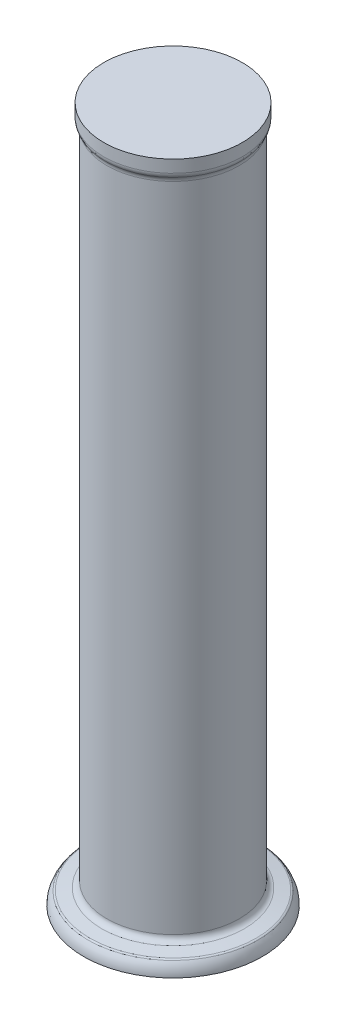
ISO-10303-21;
HEADER;
FILE_DESCRIPTION(('STEP AP214'),'2;1');
FILE_NAME('part.step','',(''),(''),'','','');
FILE_SCHEMA(('AUTOMOTIVE_DESIGN { 1 0 10303 214 1 1 1 1 }'));
ENDSEC;
DATA;
#1=APPLICATION_CONTEXT('core data for automotive mechanical design processes');
#2=APPLICATION_PROTOCOL_DEFINITION('international standard','automotive_design',2000,#1);
#3=PRODUCT_CONTEXT('',#1,'mechanical');
#4=PRODUCT('Part','Part','',(#3));
#5=PRODUCT_RELATED_PRODUCT_CATEGORY('part','',(#4));
#6=PRODUCT_DEFINITION_FORMATION('','',#4);
#7=PRODUCT_DEFINITION_CONTEXT('part definition',#1,'design');
#8=PRODUCT_DEFINITION('design','',#6,#7);
#9=PRODUCT_DEFINITION_SHAPE('','',#8);
#10=(LENGTH_UNIT() NAMED_UNIT(*) SI_UNIT(.MILLI.,.METRE.));
#11=(NAMED_UNIT(*) PLANE_ANGLE_UNIT() SI_UNIT($,.RADIAN.));
#12=(NAMED_UNIT(*) SI_UNIT($,.STERADIAN.) SOLID_ANGLE_UNIT());
#13=UNCERTAINTY_MEASURE_WITH_UNIT(LENGTH_MEASURE(1.E-05),#10,'distance_accuracy_value','');
#14=(GEOMETRIC_REPRESENTATION_CONTEXT(3) GLOBAL_UNCERTAINTY_ASSIGNED_CONTEXT((#13)) GLOBAL_UNIT_ASSIGNED_CONTEXT((#10,
#11,#12)) REPRESENTATION_CONTEXT('',''));
#15=CARTESIAN_POINT('',(0.,0.,0.));
#16=DIRECTION('',(0.,0.,1.));
#17=DIRECTION('',(1.,0.,0.));
#18=AXIS2_PLACEMENT_3D('',#15,#16,#17);
#19=CARTESIAN_POINT('',(-72.4999999813096,751.310437459211,-48.1907122347496));
#20=DIRECTION('',(0.,-1.,0.));
#21=DIRECTION('',(1.,0.,0.));
#22=AXIS2_PLACEMENT_3D('',#19,#20,#21);
#23=PLANE('',#22);
#24=CARTESIAN_POINT('',(1.86903568765692E-08,751.310437459212,-48.1907122347491));
#25=DIRECTION('',(0.,1.,0.));
#26=DIRECTION('',(-1.,0.,0.));
#27=AXIS2_PLACEMENT_3D('',#24,#25,#26);
#28=CIRCLE('',#27,72.5);
#29=CARTESIAN_POINT('',(-72.4999999813097,751.310437459211,-48.1907122347491));
#30=VERTEX_POINT('',#29);
#31=EDGE_CURVE('E43',#30,#30,#28,.T.);
#32=ORIENTED_EDGE('',*,*,#31,.F.);
#33=EDGE_LOOP('',(#32));
#34=FACE_BOUND('',#33,.T.);
#35=ADVANCED_FACE('F40',(#34),#23,.T.);
#36=CARTESIAN_POINT('',(1.86903568765692E-08,751.310437459212,-48.1907122347491));
#37=DIRECTION('',(0.,1.,0.));
#38=DIRECTION('',(-1.,0.,0.));
#39=AXIS2_PLACEMENT_3D('',#36,#37,#38);
#40=TOROIDAL_SURFACE('',#39,57.1619868849743,15.3380131150257);
#41=CARTESIAN_POINT('',(1.86903166068886E-08,761.154685082158,-48.1907122347491));
#42=DIRECTION('',(0.,1.,0.));
#43=DIRECTION('',(0.,0.,1.));
#44=AXIS2_PLACEMENT_3D('',#41,#42,#43);
#45=CIRCLE('',#44,68.9240205124901);
#46=CARTESIAN_POINT('',(1.86898421764746E-08,761.154685082158,20.733308277741));
#47=VERTEX_POINT('',#46);
#48=EDGE_CURVE('E91',#47,#47,#45,.T.);
#49=ORIENTED_EDGE('',*,*,#48,.F.);
#50=EDGE_LOOP('',(#49));
#51=FACE_BOUND('',#50,.T.);
#52=ORIENTED_EDGE('',*,*,#31,.T.);
#53=EDGE_LOOP('',(#52));
#54=FACE_BOUND('',#53,.T.);
#55=ADVANCED_FACE('F102',(#51,#54),#40,.T.);
#56=CARTESIAN_POINT('',(-56.2508567962826,1315.43543745921,-48.1907122347493));
#57=DIRECTION('',(0.,1.,0.));
#58=DIRECTION('',(0.,0.,1.));
#59=AXIS2_PLACEMENT_3D('',#56,#57,#58);
#60=PLANE('',#59);
#61=CARTESIAN_POINT('',(1.86880828275645E-08,1315.43543745924,-48.1907122347489));
#62=DIRECTION('',(0.,1.,0.));
#63=DIRECTION('',(-1.,0.,0.));
#64=AXIS2_PLACEMENT_3D('',#61,#62,#63);
#65=CIRCLE('',#64,56.2508568149707);
#66=CARTESIAN_POINT('',(-56.2508567962826,1315.43543745924,-48.1907122347489));
#67=VERTEX_POINT('',#66);
#68=EDGE_CURVE('E88',#67,#67,#65,.F.);
#69=ORIENTED_EDGE('',*,*,#68,.F.);
#70=EDGE_LOOP('',(#69));
#71=FACE_BOUND('',#70,.T.);
#72=ADVANCED_FACE('F99',(#71),#60,.T.);
#73=CARTESIAN_POINT('',(1.86903224596554E-08,759.707905342011,-48.1907122347491));
#74=DIRECTION('',(0.,1.,0.));
#75=DIRECTION('',(0.,0.,1.));
#76=AXIS2_PLACEMENT_3D('',#73,#74,#75);
#77=TOROIDAL_SURFACE('',#76,67.1953894776967,2.25418208469296);
#78=CARTESIAN_POINT('',(1.86903213494324E-08,761.927841335718,-48.1907122347491));
#79=DIRECTION('',(0.,-1.,0.));
#80=DIRECTION('',(1.,0.,0.));
#81=AXIS2_PLACEMENT_3D('',#78,#79,#80);
#82=CIRCLE('',#81,67.5868240888334);
#83=CARTESIAN_POINT('',(67.5868241075238,761.927841335718,-48.1907122347487));
#84=VERTEX_POINT('',#83);
#85=EDGE_CURVE('E84',#84,#84,#82,.F.);
#86=ORIENTED_EDGE('',*,*,#85,.F.);
#87=EDGE_LOOP('',(#86));
#88=FACE_BOUND('',#87,.T.);
#89=ORIENTED_EDGE('',*,*,#48,.T.);
#90=EDGE_LOOP('',(#89));
#91=FACE_BOUND('',#90,.T.);
#92=ADVANCED_FACE('F94',(#88,#91),#77,.T.);
#93=CARTESIAN_POINT('',(1.86880828275645E-08,1315.4354374592,-48.1907122347489));
#94=DIRECTION('',(0.,1.,0.));
#95=DIRECTION('',(-1.,0.,0.));
#96=AXIS2_PLACEMENT_3D('',#93,#94,#95);
#97=CONICAL_SURFACE('',#96,56.2508568149707,8.56814967798771E-05);
#98=ORIENTED_EDGE('',*,*,#68,.T.);
#99=EDGE_LOOP('',(#98));
#100=FACE_BOUND('',#99,.T.);
#101=CARTESIAN_POINT('',(1.86881153384488E-08,1305.43490194986,-48.1907122347489));
#102=DIRECTION('',(0.,1.,0.));
#103=DIRECTION('',(0.,0.,1.));
#104=AXIS2_PLACEMENT_3D('',#101,#102,#103);
#105=CIRCLE('',#104,56.2499999627199);
#106=CARTESIAN_POINT('',(1.86877281481692E-08,1305.43490194986,8.05928772797093));
#107=VERTEX_POINT('',#106);
#108=EDGE_CURVE('E81',#107,#107,#105,.F.);
#109=ORIENTED_EDGE('',*,*,#108,.F.);
#110=EDGE_LOOP('',(#109));
#111=FACE_BOUND('',#110,.T.);
#112=ADVANCED_FACE('F98',(#100,#111),#97,.T.);
#113=CARTESIAN_POINT('',(1.86903206208485E-08,761.927841335718,-48.1907122347491));
#114=DIRECTION('',(0.,-1.,0.));
#115=DIRECTION('',(1.,0.,0.));
#116=AXIS2_PLACEMENT_3D('',#113,#114,#115);
#117=CONICAL_SURFACE('',#116,67.5868240888334,1.39626340159545);
#118=ORIENTED_EDGE('',*,*,#85,.T.);
#119=EDGE_LOOP('',(#118));
#120=FACE_BOUND('',#119,.T.);
#121=CARTESIAN_POINT('',(1.86903068521027E-08,763.639106140721,-48.1907122347491));
#122=DIRECTION('',(0.,1.,0.));
#123=DIRECTION('',(-1.,0.,0.));
#124=AXIS2_PLACEMENT_3D('',#121,#122,#123);
#125=CIRCLE('',#124,57.8817591116652);
#126=CARTESIAN_POINT('',(-57.8817590929749,763.639106140721,-48.1907122347495));
#127=VERTEX_POINT('',#126);
#128=EDGE_CURVE('E78',#127,#127,#125,.F.);
#129=ORIENTED_EDGE('',*,*,#128,.T.);
#130=EDGE_LOOP('',(#129));
#131=FACE_BOUND('',#130,.T.);
#132=ADVANCED_FACE('F147',(#120,#131),#117,.T.);
#133=CARTESIAN_POINT('',(1.86881153362825E-08,1305.43543745921,-48.1907122347489));
#134=DIRECTION('',(0.,1.,0.));
#135=DIRECTION('',(0.,0.,1.));
#136=AXIS2_PLACEMENT_3D('',#133,#134,#135);
#137=TOROIDAL_SURFACE('',#136,50.0000000000001,6.24999998566141);
#138=ORIENTED_EDGE('',*,*,#108,.T.);
#139=EDGE_LOOP('',(#138));
#140=FACE_BOUND('',#139,.T.);
#141=CARTESIAN_POINT('',(1.86881390239315E-08,1301.68543746093,-48.1907122347489));
#142=DIRECTION('',(0.,1.,0.));
#143=DIRECTION('',(-1.,0.,0.));
#144=AXIS2_PLACEMENT_3D('',#141,#142,#143);
#145=CIRCLE('',#144,54.9999999977058);
#146=CARTESIAN_POINT('',(-54.9999999790177,1301.68543746093,-48.1907122347493));
#147=VERTEX_POINT('',#146);
#148=EDGE_CURVE('E54',#147,#147,#145,.T.);
#149=ORIENTED_EDGE('',*,*,#148,.T.);
#150=EDGE_LOOP('',(#149));
#151=FACE_BOUND('',#150,.T.);
#152=ADVANCED_FACE('F71',(#140,#151),#137,.T.);
#153=CARTESIAN_POINT('',(1.86902869325186E-08,768.563144905782,-48.1907122347491));
#154=DIRECTION('',(0.,1.,0.));
#155=DIRECTION('',(-1.,0.,0.));
#156=AXIS2_PLACEMENT_3D('',#153,#154,#155);
#157=TOROIDAL_SURFACE('',#156,58.75,5.);
#158=ORIENTED_EDGE('',*,*,#128,.F.);
#159=EDGE_LOOP('',(#158));
#160=FACE_BOUND('',#159,.T.);
#161=CARTESIAN_POINT('',(1.86902948544564E-08,768.563144905783,-48.1907122347491));
#162=DIRECTION('',(0.,-1.,0.));
#163=DIRECTION('',(1.,0.,0.));
#164=AXIS2_PLACEMENT_3D('',#161,#162,#163);
#165=CIRCLE('',#164,53.75);
#166=CARTESIAN_POINT('',(53.7500000186903,768.563144905783,-48.1907122347491));
#167=VERTEX_POINT('',#166);
#168=EDGE_CURVE('E48',#167,#167,#165,.F.);
#169=ORIENTED_EDGE('',*,*,#168,.F.);
#170=EDGE_LOOP('',(#169));
#171=FACE_BOUND('',#170,.T.);
#172=ADVANCED_FACE('F66',(#160,#171),#157,.F.);
#173=CARTESIAN_POINT('',(1.86881541940883E-08,1297.93543745921,-48.1907122347489));
#174=DIRECTION('',(0.,1.,0.));
#175=DIRECTION('',(-1.,0.,0.));
#176=AXIS2_PLACEMENT_3D('',#173,#174,#175);
#177=TOROIDAL_SURFACE('',#176,60.,6.2500000028677);
#178=CARTESIAN_POINT('',(1.86881533449412E-08,1297.93543745921,-48.1907122347489));
#179=DIRECTION('',(0.,-1.,0.));
#180=DIRECTION('',(1.,0.,0.));
#181=AXIS2_PLACEMENT_3D('',#178,#179,#180);
#182=CIRCLE('',#181,53.75);
#183=CARTESIAN_POINT('',(53.7500000186882,1297.93543745921,-48.1907122347489));
#184=VERTEX_POINT('',#183);
#185=EDGE_CURVE('E10',#184,#184,#182,.T.);
#186=ORIENTED_EDGE('',*,*,#185,.F.);
#187=EDGE_LOOP('',(#186));
#188=FACE_BOUND('',#187,.T.);
#189=ORIENTED_EDGE('',*,*,#148,.F.);
#190=EDGE_LOOP('',(#189));
#191=FACE_BOUND('',#190,.T.);
#192=ADVANCED_FACE('F61',(#188,#191),#177,.F.);
#193=CARTESIAN_POINT('',(1.86903646481303E-08,751.310437459212,-48.1907122347491));
#194=DIRECTION('',(0.,-1.,0.));
#195=DIRECTION('',(1.,0.,0.));
#196=AXIS2_PLACEMENT_3D('',#193,#194,#195);
#197=CYLINDRICAL_SURFACE('',#196,53.75);
#198=ORIENTED_EDGE('',*,*,#168,.T.);
#199=EDGE_LOOP('',(#198));
#200=FACE_BOUND('',#199,.T.);
#201=ORIENTED_EDGE('',*,*,#185,.T.);
#202=EDGE_LOOP('',(#201));
#203=FACE_BOUND('',#202,.T.);
#204=ADVANCED_FACE('F65',(#200,#203),#197,.T.);
#205=CLOSED_SHELL('',(#35,#55,#72,#92,#112,#132,#152,#172,#192,#204));
#206=MANIFOLD_SOLID_BREP('B2',#205);
#207=ADVANCED_BREP_SHAPE_REPRESENTATION('',(#18,#206),#14);
#208=SHAPE_DEFINITION_REPRESENTATION(#9,#207);
ENDSEC;
END-ISO-10303-21;
